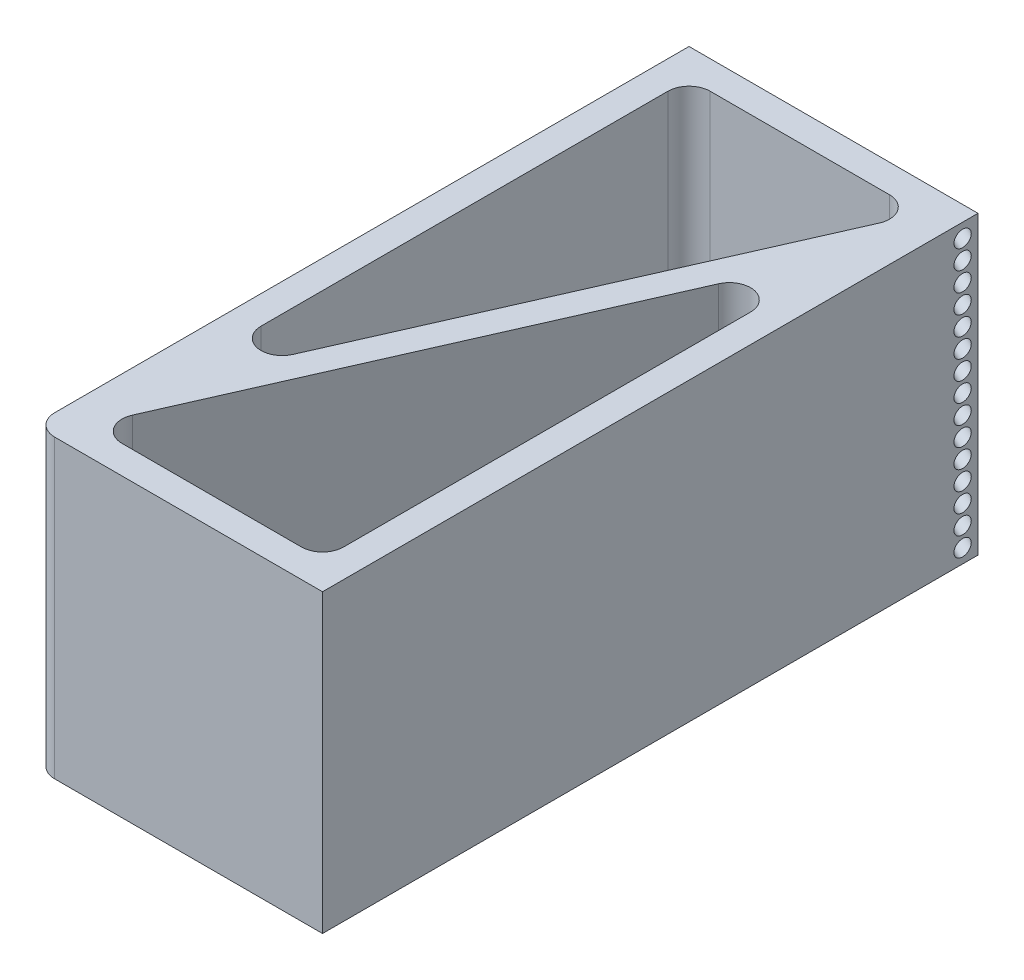
ISO-10303-21;
HEADER;
FILE_DESCRIPTION(('STEP AP214'),'2;1');
FILE_NAME('part.step','',(''),(''),'','','');
FILE_SCHEMA(('AUTOMOTIVE_DESIGN { 1 0 10303 214 1 1 1 1 }'));
ENDSEC;
DATA;
#1=APPLICATION_CONTEXT('core data for automotive mechanical design processes');
#2=APPLICATION_PROTOCOL_DEFINITION('international standard','automotive_design',2000,#1);
#3=PRODUCT_CONTEXT('',#1,'mechanical');
#4=PRODUCT('Part','Part','',(#3));
#5=PRODUCT_RELATED_PRODUCT_CATEGORY('part','',(#4));
#6=PRODUCT_DEFINITION_FORMATION('','',#4);
#7=PRODUCT_DEFINITION_CONTEXT('part definition',#1,'design');
#8=PRODUCT_DEFINITION('design','',#6,#7);
#9=PRODUCT_DEFINITION_SHAPE('','',#8);
#10=(LENGTH_UNIT() NAMED_UNIT(*) SI_UNIT(.MILLI.,.METRE.));
#11=(NAMED_UNIT(*) PLANE_ANGLE_UNIT() SI_UNIT($,.RADIAN.));
#12=(NAMED_UNIT(*) SI_UNIT($,.STERADIAN.) SOLID_ANGLE_UNIT());
#13=UNCERTAINTY_MEASURE_WITH_UNIT(LENGTH_MEASURE(1.E-05),#10,'distance_accuracy_value','');
#14=(GEOMETRIC_REPRESENTATION_CONTEXT(3) GLOBAL_UNCERTAINTY_ASSIGNED_CONTEXT((#13)) GLOBAL_UNIT_ASSIGNED_CONTEXT((#10,
#11,#12)) REPRESENTATION_CONTEXT('',''));
#15=CARTESIAN_POINT('',(0.,0.,0.));
#16=DIRECTION('',(0.,0.,1.));
#17=DIRECTION('',(1.,0.,0.));
#18=AXIS2_PLACEMENT_3D('',#15,#16,#17);
#19=CARTESIAN_POINT('',(20.5,42.,46.5));
#20=DIRECTION('',(-1.,0.,0.));
#21=DIRECTION('',(0.,0.,1.));
#22=AXIS2_PLACEMENT_3D('',#19,#20,#21);
#23=PLANE('',#22);
#24=CARTESIAN_POINT('',(20.5,40.,-44.3142665036951));
#25=DIRECTION('',(-1.,0.,0.));
#26=DIRECTION('',(0.,0.,-1.));
#27=AXIS2_PLACEMENT_3D('',#24,#25,#26);
#28=ELLIPSE('',#27,1.22947509167147,1.125);
#29=CARTESIAN_POINT('',(20.5,40.,-45.5437415953666));
#30=VERTEX_POINT('',#29);
#31=EDGE_CURVE('E242',#30,#30,#28,.T.);
#32=ORIENTED_EDGE('',*,*,#31,.T.);
#33=EDGE_LOOP('',(#32));
#34=FACE_BOUND('',#33,.T.);
#35=CARTESIAN_POINT('',(20.5,37.2857142857143,-44.3142665036951));
#36=DIRECTION('',(-1.,0.,0.));
#37=DIRECTION('',(0.,0.,-1.));
#38=AXIS2_PLACEMENT_3D('',#35,#36,#37);
#39=ELLIPSE('',#38,1.22947509167147,1.125);
#40=CARTESIAN_POINT('',(20.5,37.2857142857143,-45.5437415953666));
#41=VERTEX_POINT('',#40);
#42=EDGE_CURVE('E239',#41,#41,#39,.T.);
#43=ORIENTED_EDGE('',*,*,#42,.T.);
#44=EDGE_LOOP('',(#43));
#45=FACE_BOUND('',#44,.T.);
#46=CARTESIAN_POINT('',(20.5,34.5714285714286,-44.3142665036951));
#47=DIRECTION('',(-1.,0.,0.));
#48=DIRECTION('',(0.,0.,-1.));
#49=AXIS2_PLACEMENT_3D('',#46,#47,#48);
#50=ELLIPSE('',#49,1.22947509167147,1.125);
#51=CARTESIAN_POINT('',(20.5,34.5714285714286,-45.5437415953665));
#52=VERTEX_POINT('',#51);
#53=EDGE_CURVE('E235',#52,#52,#50,.T.);
#54=ORIENTED_EDGE('',*,*,#53,.T.);
#55=EDGE_LOOP('',(#54));
#56=FACE_BOUND('',#55,.T.);
#57=CARTESIAN_POINT('',(20.5,31.8571428571429,-44.3142665036951));
#58=DIRECTION('',(-1.,0.,0.));
#59=DIRECTION('',(0.,0.,-1.));
#60=AXIS2_PLACEMENT_3D('',#57,#58,#59);
#61=ELLIPSE('',#60,1.22947509167147,1.125);
#62=CARTESIAN_POINT('',(20.5,31.8571428571429,-45.5437415953665));
#63=VERTEX_POINT('',#62);
#64=EDGE_CURVE('E231',#63,#63,#61,.T.);
#65=ORIENTED_EDGE('',*,*,#64,.T.);
#66=EDGE_LOOP('',(#65));
#67=FACE_BOUND('',#66,.T.);
#68=CARTESIAN_POINT('',(20.5,29.1428571428571,-44.314266503695));
#69=DIRECTION('',(-1.,0.,0.));
#70=DIRECTION('',(0.,0.,-1.));
#71=AXIS2_PLACEMENT_3D('',#68,#69,#70);
#72=ELLIPSE('',#71,1.22947509167147,1.125);
#73=CARTESIAN_POINT('',(20.5,29.1428571428571,-45.5437415953665));
#74=VERTEX_POINT('',#73);
#75=EDGE_CURVE('E227',#74,#74,#72,.T.);
#76=ORIENTED_EDGE('',*,*,#75,.T.);
#77=EDGE_LOOP('',(#76));
#78=FACE_BOUND('',#77,.T.);
#79=CARTESIAN_POINT('',(20.5,26.4285714285714,-44.314266503695));
#80=DIRECTION('',(-1.,0.,0.));
#81=DIRECTION('',(0.,0.,-1.));
#82=AXIS2_PLACEMENT_3D('',#79,#80,#81);
#83=ELLIPSE('',#82,1.22947509167147,1.125);
#84=CARTESIAN_POINT('',(20.5,26.4285714285714,-45.5437415953665));
#85=VERTEX_POINT('',#84);
#86=EDGE_CURVE('E223',#85,#85,#83,.T.);
#87=ORIENTED_EDGE('',*,*,#86,.T.);
#88=EDGE_LOOP('',(#87));
#89=FACE_BOUND('',#88,.T.);
#90=CARTESIAN_POINT('',(20.5,23.7142857142857,-44.314266503695));
#91=DIRECTION('',(-1.,0.,0.));
#92=DIRECTION('',(0.,0.,-1.));
#93=AXIS2_PLACEMENT_3D('',#90,#91,#92);
#94=ELLIPSE('',#93,1.22947509167148,1.125);
#95=CARTESIAN_POINT('',(20.5,23.7142857142857,-45.5437415953664));
#96=VERTEX_POINT('',#95);
#97=EDGE_CURVE('E219',#96,#96,#94,.T.);
#98=ORIENTED_EDGE('',*,*,#97,.T.);
#99=EDGE_LOOP('',(#98));
#100=FACE_BOUND('',#99,.T.);
#101=CARTESIAN_POINT('',(20.5,21.,-44.3142665036949));
#102=DIRECTION('',(-1.,0.,0.));
#103=DIRECTION('',(0.,0.,-1.));
#104=AXIS2_PLACEMENT_3D('',#101,#102,#103);
#105=ELLIPSE('',#104,1.22947509167147,1.125);
#106=CARTESIAN_POINT('',(20.5,21.,-45.5437415953664));
#107=VERTEX_POINT('',#106);
#108=EDGE_CURVE('E215',#107,#107,#105,.T.);
#109=ORIENTED_EDGE('',*,*,#108,.T.);
#110=EDGE_LOOP('',(#109));
#111=FACE_BOUND('',#110,.T.);
#112=CARTESIAN_POINT('',(20.5,18.2857142857143,-44.3142665036949));
#113=DIRECTION('',(-1.,0.,0.));
#114=DIRECTION('',(0.,0.,-1.));
#115=AXIS2_PLACEMENT_3D('',#112,#113,#114);
#116=ELLIPSE('',#115,1.22947509167147,1.125);
#117=CARTESIAN_POINT('',(20.5,18.2857142857143,-45.5437415953664));
#118=VERTEX_POINT('',#117);
#119=EDGE_CURVE('E211',#118,#118,#116,.T.);
#120=ORIENTED_EDGE('',*,*,#119,.T.);
#121=EDGE_LOOP('',(#120));
#122=FACE_BOUND('',#121,.T.);
#123=CARTESIAN_POINT('',(20.5,15.5714285714286,-44.3142665036949));
#124=DIRECTION('',(-1.,0.,0.));
#125=DIRECTION('',(0.,0.,-1.));
#126=AXIS2_PLACEMENT_3D('',#123,#124,#125);
#127=ELLIPSE('',#126,1.22947509167148,1.125);
#128=CARTESIAN_POINT('',(20.5,15.5714285714286,-45.5437415953663));
#129=VERTEX_POINT('',#128);
#130=EDGE_CURVE('E207',#129,#129,#127,.T.);
#131=ORIENTED_EDGE('',*,*,#130,.T.);
#132=EDGE_LOOP('',(#131));
#133=FACE_BOUND('',#132,.T.);
#134=CARTESIAN_POINT('',(20.5,12.8571428571429,-44.3142665036948));
#135=DIRECTION('',(-1.,0.,0.));
#136=DIRECTION('',(0.,0.,-1.));
#137=AXIS2_PLACEMENT_3D('',#134,#135,#136);
#138=ELLIPSE('',#137,1.22947509167147,1.125);
#139=CARTESIAN_POINT('',(20.5,12.8571428571429,-45.5437415953663));
#140=VERTEX_POINT('',#139);
#141=EDGE_CURVE('E203',#140,#140,#138,.T.);
#142=ORIENTED_EDGE('',*,*,#141,.T.);
#143=EDGE_LOOP('',(#142));
#144=FACE_BOUND('',#143,.T.);
#145=CARTESIAN_POINT('',(20.5,10.1428571428571,-44.3142665036948));
#146=DIRECTION('',(-1.,0.,0.));
#147=DIRECTION('',(0.,0.,-1.));
#148=AXIS2_PLACEMENT_3D('',#145,#146,#147);
#149=ELLIPSE('',#148,1.22947509167147,1.125);
#150=CARTESIAN_POINT('',(20.5,10.1428571428571,-45.5437415953663));
#151=VERTEX_POINT('',#150);
#152=EDGE_CURVE('E199',#151,#151,#149,.T.);
#153=ORIENTED_EDGE('',*,*,#152,.T.);
#154=EDGE_LOOP('',(#153));
#155=FACE_BOUND('',#154,.T.);
#156=CARTESIAN_POINT('',(20.5,7.42857142857143,-44.3142665036948));
#157=DIRECTION('',(-1.,0.,0.));
#158=DIRECTION('',(0.,0.,-1.));
#159=AXIS2_PLACEMENT_3D('',#156,#157,#158);
#160=ELLIPSE('',#159,1.22947509167148,1.125);
#161=CARTESIAN_POINT('',(20.5,7.42857142857143,-45.5437415953662));
#162=VERTEX_POINT('',#161);
#163=EDGE_CURVE('E195',#162,#162,#160,.T.);
#164=ORIENTED_EDGE('',*,*,#163,.T.);
#165=EDGE_LOOP('',(#164));
#166=FACE_BOUND('',#165,.T.);
#167=CARTESIAN_POINT('',(20.5,4.71428571428572,-44.3142665036947));
#168=DIRECTION('',(-1.,0.,0.));
#169=DIRECTION('',(0.,0.,-1.));
#170=AXIS2_PLACEMENT_3D('',#167,#168,#169);
#171=ELLIPSE('',#170,1.22947509167147,1.125);
#172=CARTESIAN_POINT('',(20.5,4.71428571428572,-45.5437415953662));
#173=VERTEX_POINT('',#172);
#174=EDGE_CURVE('E191',#173,#173,#171,.T.);
#175=ORIENTED_EDGE('',*,*,#174,.T.);
#176=EDGE_LOOP('',(#175));
#177=FACE_BOUND('',#176,.T.);
#178=CARTESIAN_POINT('',(20.5,2.,-44.3142665036947));
#179=DIRECTION('',(-1.,0.,0.));
#180=DIRECTION('',(0.,0.,-1.));
#181=AXIS2_PLACEMENT_3D('',#178,#179,#180);
#182=ELLIPSE('',#181,1.22947509167148,1.125);
#183=CARTESIAN_POINT('',(20.5,2.,-45.5437415953662));
#184=VERTEX_POINT('',#183);
#185=EDGE_CURVE('E186',#184,#184,#182,.T.);
#186=ORIENTED_EDGE('',*,*,#185,.T.);
#187=EDGE_LOOP('',(#186));
#188=FACE_BOUND('',#187,.T.);
#189=DIRECTION('',(0.,0.,-1.));
#190=VECTOR('',#189,1.);
#191=CARTESIAN_POINT('',(20.5,0.,46.5));
#192=LINE('',#191,#190);
#193=CARTESIAN_POINT('',(20.5,0.,46.5));
#194=VERTEX_POINT('',#193);
#195=CARTESIAN_POINT('',(20.5,0.,-46.5));
#196=VERTEX_POINT('',#195);
#197=EDGE_CURVE('E174',#194,#196,#192,.T.);
#198=ORIENTED_EDGE('',*,*,#197,.T.);
#199=DIRECTION('',(0.,-1.,0.));
#200=VECTOR('',#199,1.);
#201=CARTESIAN_POINT('',(20.5,42.,-46.5));
#202=LINE('',#201,#200);
#203=CARTESIAN_POINT('',(20.5,42.,-46.5));
#204=VERTEX_POINT('',#203);
#205=EDGE_CURVE('E156',#204,#196,#202,.T.);
#206=ORIENTED_EDGE('',*,*,#205,.F.);
#207=DIRECTION('',(0.,0.,-1.));
#208=VECTOR('',#207,1.);
#209=CARTESIAN_POINT('',(20.5,42.,46.5));
#210=LINE('',#209,#208);
#211=CARTESIAN_POINT('',(20.5,42.,46.5));
#212=VERTEX_POINT('',#211);
#213=EDGE_CURVE('E162',#212,#204,#210,.T.);
#214=ORIENTED_EDGE('',*,*,#213,.F.);
#215=DIRECTION('',(0.,-1.,0.));
#216=VECTOR('',#215,1.);
#217=CARTESIAN_POINT('',(20.5,42.,46.5));
#218=LINE('',#217,#216);
#219=EDGE_CURVE('E179',#212,#194,#218,.T.);
#220=ORIENTED_EDGE('',*,*,#219,.T.);
#221=EDGE_LOOP('',(#198,#206,#214,#220));
#222=FACE_BOUND('',#221,.T.);
#223=ADVANCED_FACE('F33',(#34,#45,#56,#67,#78,#89,#100,#111,#122,#133,#144,#155,#166,#177,#188,
#222),#23,.F.);
#224=CARTESIAN_POINT('',(-20.5,42.,-46.5));
#225=DIRECTION('',(0.,0.,1.));
#226=DIRECTION('',(1.,0.,0.));
#227=AXIS2_PLACEMENT_3D('',#224,#225,#226);
#228=PLANE('',#227);
#229=CARTESIAN_POINT('',(15.5421167035036,40.,-46.5));
#230=DIRECTION('',(0.,0.,1.));
#231=DIRECTION('',(-1.,0.,0.));
#232=AXIS2_PLACEMENT_3D('',#229,#230,#231);
#233=ELLIPSE('',#232,2.78880935427919,1.125);
#234=CARTESIAN_POINT('',(12.7533073492244,40.,-46.5));
#235=VERTEX_POINT('',#234);
#236=EDGE_CURVE('E240',#235,#235,#233,.T.);
#237=ORIENTED_EDGE('',*,*,#236,.T.);
#238=EDGE_LOOP('',(#237));
#239=FACE_BOUND('',#238,.T.);
#240=CARTESIAN_POINT('',(15.5421167035036,37.2857142857143,-46.5));
#241=DIRECTION('',(0.,0.,1.));
#242=DIRECTION('',(-1.,0.,0.));
#243=AXIS2_PLACEMENT_3D('',#240,#241,#242);
#244=ELLIPSE('',#243,2.78880935427919,1.125);
#245=CARTESIAN_POINT('',(12.7533073492244,37.2857142857143,-46.5));
#246=VERTEX_POINT('',#245);
#247=EDGE_CURVE('E236',#246,#246,#244,.T.);
#248=ORIENTED_EDGE('',*,*,#247,.T.);
#249=EDGE_LOOP('',(#248));
#250=FACE_BOUND('',#249,.T.);
#251=CARTESIAN_POINT('',(15.5421167035035,34.5714285714286,-46.5));
#252=DIRECTION('',(0.,0.,1.));
#253=DIRECTION('',(-1.,0.,0.));
#254=AXIS2_PLACEMENT_3D('',#251,#252,#253);
#255=ELLIPSE('',#254,2.78880935427919,1.125);
#256=CARTESIAN_POINT('',(12.7533073492243,34.5714285714286,-46.5));
#257=VERTEX_POINT('',#256);
#258=EDGE_CURVE('E232',#257,#257,#255,.T.);
#259=ORIENTED_EDGE('',*,*,#258,.T.);
#260=EDGE_LOOP('',(#259));
#261=FACE_BOUND('',#260,.T.);
#262=CARTESIAN_POINT('',(15.5421167035034,31.8571428571429,-46.5));
#263=DIRECTION('',(0.,0.,1.));
#264=DIRECTION('',(-1.,0.,0.));
#265=AXIS2_PLACEMENT_3D('',#262,#263,#264);
#266=ELLIPSE('',#265,2.78880935427919,1.125);
#267=CARTESIAN_POINT('',(12.7533073492242,31.8571428571429,-46.5));
#268=VERTEX_POINT('',#267);
#269=EDGE_CURVE('E228',#268,#268,#266,.T.);
#270=ORIENTED_EDGE('',*,*,#269,.T.);
#271=EDGE_LOOP('',(#270));
#272=FACE_BOUND('',#271,.T.);
#273=CARTESIAN_POINT('',(15.5421167035033,29.1428571428571,-46.5));
#274=DIRECTION('',(0.,0.,1.));
#275=DIRECTION('',(-1.,0.,0.));
#276=AXIS2_PLACEMENT_3D('',#273,#274,#275);
#277=ELLIPSE('',#276,2.78880935427919,1.125);
#278=CARTESIAN_POINT('',(12.7533073492241,29.1428571428571,-46.5));
#279=VERTEX_POINT('',#278);
#280=EDGE_CURVE('E224',#279,#279,#277,.T.);
#281=ORIENTED_EDGE('',*,*,#280,.T.);
#282=EDGE_LOOP('',(#281));
#283=FACE_BOUND('',#282,.T.);
#284=CARTESIAN_POINT('',(15.5421167035033,26.4285714285714,-46.5));
#285=DIRECTION('',(0.,0.,1.));
#286=DIRECTION('',(-1.,0.,0.));
#287=AXIS2_PLACEMENT_3D('',#284,#285,#286);
#288=ELLIPSE('',#287,2.78880935427919,1.125);
#289=CARTESIAN_POINT('',(12.7533073492241,26.4285714285714,-46.5));
#290=VERTEX_POINT('',#289);
#291=EDGE_CURVE('E220',#290,#290,#288,.T.);
#292=ORIENTED_EDGE('',*,*,#291,.T.);
#293=EDGE_LOOP('',(#292));
#294=FACE_BOUND('',#293,.T.);
#295=CARTESIAN_POINT('',(15.5421167035032,23.7142857142857,-46.5));
#296=DIRECTION('',(0.,0.,1.));
#297=DIRECTION('',(-1.,0.,0.));
#298=AXIS2_PLACEMENT_3D('',#295,#296,#297);
#299=ELLIPSE('',#298,2.78880935427921,1.125);
#300=CARTESIAN_POINT('',(12.753307349224,23.7142857142857,-46.5));
#301=VERTEX_POINT('',#300);
#302=EDGE_CURVE('E216',#301,#301,#299,.T.);
#303=ORIENTED_EDGE('',*,*,#302,.T.);
#304=EDGE_LOOP('',(#303));
#305=FACE_BOUND('',#304,.T.);
#306=CARTESIAN_POINT('',(15.5421167035031,21.,-46.5));
#307=DIRECTION('',(0.,0.,1.));
#308=DIRECTION('',(-1.,0.,0.));
#309=AXIS2_PLACEMENT_3D('',#306,#307,#308);
#310=ELLIPSE('',#309,2.78880935427919,1.125);
#311=CARTESIAN_POINT('',(12.7533073492239,21.,-46.5));
#312=VERTEX_POINT('',#311);
#313=EDGE_CURVE('E212',#312,#312,#310,.T.);
#314=ORIENTED_EDGE('',*,*,#313,.T.);
#315=EDGE_LOOP('',(#314));
#316=FACE_BOUND('',#315,.T.);
#317=CARTESIAN_POINT('',(15.542116703503,18.2857142857143,-46.5));
#318=DIRECTION('',(0.,0.,1.));
#319=DIRECTION('',(-1.,0.,0.));
#320=AXIS2_PLACEMENT_3D('',#317,#318,#319);
#321=ELLIPSE('',#320,2.78880935427919,1.125);
#322=CARTESIAN_POINT('',(12.7533073492239,18.2857142857143,-46.5));
#323=VERTEX_POINT('',#322);
#324=EDGE_CURVE('E208',#323,#323,#321,.T.);
#325=ORIENTED_EDGE('',*,*,#324,.T.);
#326=EDGE_LOOP('',(#325));
#327=FACE_BOUND('',#326,.T.);
#328=CARTESIAN_POINT('',(15.542116703503,15.5714285714286,-46.5));
#329=DIRECTION('',(0.,0.,1.));
#330=DIRECTION('',(-1.,0.,0.));
#331=AXIS2_PLACEMENT_3D('',#328,#329,#330);
#332=ELLIPSE('',#331,2.7888093542792,1.125);
#333=CARTESIAN_POINT('',(12.7533073492238,15.5714285714286,-46.5));
#334=VERTEX_POINT('',#333);
#335=EDGE_CURVE('E204',#334,#334,#332,.T.);
#336=ORIENTED_EDGE('',*,*,#335,.T.);
#337=EDGE_LOOP('',(#336));
#338=FACE_BOUND('',#337,.T.);
#339=CARTESIAN_POINT('',(15.5421167035029,12.8571428571429,-46.5));
#340=DIRECTION('',(0.,0.,1.));
#341=DIRECTION('',(-1.,0.,0.));
#342=AXIS2_PLACEMENT_3D('',#339,#340,#341);
#343=ELLIPSE('',#342,2.78880935427919,1.125);
#344=CARTESIAN_POINT('',(12.7533073492237,12.8571428571429,-46.5));
#345=VERTEX_POINT('',#344);
#346=EDGE_CURVE('E200',#345,#345,#343,.T.);
#347=ORIENTED_EDGE('',*,*,#346,.T.);
#348=EDGE_LOOP('',(#347));
#349=FACE_BOUND('',#348,.T.);
#350=CARTESIAN_POINT('',(15.5421167035028,10.1428571428571,-46.5));
#351=DIRECTION('',(0.,0.,1.));
#352=DIRECTION('',(-1.,0.,0.));
#353=AXIS2_PLACEMENT_3D('',#350,#351,#352);
#354=ELLIPSE('',#353,2.78880935427919,1.125);
#355=CARTESIAN_POINT('',(12.7533073492237,10.1428571428571,-46.5));
#356=VERTEX_POINT('',#355);
#357=EDGE_CURVE('E196',#356,#356,#354,.T.);
#358=ORIENTED_EDGE('',*,*,#357,.T.);
#359=EDGE_LOOP('',(#358));
#360=FACE_BOUND('',#359,.T.);
#361=CARTESIAN_POINT('',(15.5421167035028,7.42857142857143,-46.5));
#362=DIRECTION('',(0.,0.,1.));
#363=DIRECTION('',(-1.,0.,0.));
#364=AXIS2_PLACEMENT_3D('',#361,#362,#363);
#365=ELLIPSE('',#364,2.78880935427921,1.125);
#366=CARTESIAN_POINT('',(12.7533073492236,7.42857142857143,-46.5));
#367=VERTEX_POINT('',#366);
#368=EDGE_CURVE('E192',#367,#367,#365,.T.);
#369=ORIENTED_EDGE('',*,*,#368,.T.);
#370=EDGE_LOOP('',(#369));
#371=FACE_BOUND('',#370,.T.);
#372=CARTESIAN_POINT('',(15.5421167035027,4.71428571428572,-46.5));
#373=DIRECTION('',(0.,0.,1.));
#374=DIRECTION('',(-1.,0.,0.));
#375=AXIS2_PLACEMENT_3D('',#372,#373,#374);
#376=ELLIPSE('',#375,2.78880935427919,1.125);
#377=CARTESIAN_POINT('',(12.7533073492235,4.71428571428572,-46.5));
#378=VERTEX_POINT('',#377);
#379=EDGE_CURVE('E188',#378,#378,#376,.T.);
#380=ORIENTED_EDGE('',*,*,#379,.T.);
#381=EDGE_LOOP('',(#380));
#382=FACE_BOUND('',#381,.T.);
#383=CARTESIAN_POINT('',(15.5421167035026,2.,-46.5));
#384=DIRECTION('',(0.,0.,1.));
#385=DIRECTION('',(-1.,0.,0.));
#386=AXIS2_PLACEMENT_3D('',#383,#384,#385);
#387=ELLIPSE('',#386,2.78880935427921,1.125);
#388=CARTESIAN_POINT('',(12.7533073492234,2.,-46.5));
#389=VERTEX_POINT('',#388);
#390=EDGE_CURVE('E183',#389,#389,#387,.T.);
#391=ORIENTED_EDGE('',*,*,#390,.T.);
#392=EDGE_LOOP('',(#391));
#393=FACE_BOUND('',#392,.T.);
#394=DIRECTION('',(-1.,0.,0.));
#395=VECTOR('',#394,1.);
#396=CARTESIAN_POINT('',(-20.5,0.,-46.5));
#397=LINE('',#396,#395);
#398=CARTESIAN_POINT('',(-20.5,0.,-46.5));
#399=VERTEX_POINT('',#398);
#400=EDGE_CURVE('E306',#196,#399,#397,.T.);
#401=ORIENTED_EDGE('',*,*,#400,.T.);
#402=DIRECTION('',(0.,-1.,0.));
#403=VECTOR('',#402,1.);
#404=CARTESIAN_POINT('',(-20.5,42.,-46.5));
#405=LINE('',#404,#403);
#406=CARTESIAN_POINT('',(-20.5,42.,-46.5));
#407=VERTEX_POINT('',#406);
#408=EDGE_CURVE('E159',#407,#399,#405,.T.);
#409=ORIENTED_EDGE('',*,*,#408,.F.);
#410=DIRECTION('',(-1.,0.,0.));
#411=VECTOR('',#410,1.);
#412=CARTESIAN_POINT('',(-20.5,42.,-46.5));
#413=LINE('',#412,#411);
#414=EDGE_CURVE('E152',#204,#407,#413,.T.);
#415=ORIENTED_EDGE('',*,*,#414,.F.);
#416=ORIENTED_EDGE('',*,*,#205,.T.);
#417=EDGE_LOOP('',(#401,#409,#415,#416));
#418=FACE_BOUND('',#417,.T.);
#419=ADVANCED_FACE('F154',(#239,#250,#261,#272,#283,#294,#305,#316,#327,#338,#349,#360,#371,
#382,#393,#418),#228,.F.);
#420=CARTESIAN_POINT('',(-20.5,42.,46.5));
#421=DIRECTION('',(1.,0.,0.));
#422=DIRECTION('',(0.,0.,-1.));
#423=AXIS2_PLACEMENT_3D('',#420,#421,#422);
#424=PLANE('',#423);
#425=DIRECTION('',(0.,0.,1.));
#426=VECTOR('',#425,1.);
#427=CARTESIAN_POINT('',(-20.5,0.,46.5));
#428=LINE('',#427,#426);
#429=CARTESIAN_POINT('',(-20.5,0.,43.5));
#430=VERTEX_POINT('',#429);
#431=EDGE_CURVE('E304',#399,#430,#428,.T.);
#432=ORIENTED_EDGE('',*,*,#431,.T.);
#433=DIRECTION('',(0.,-1.,0.));
#434=VECTOR('',#433,1.);
#435=CARTESIAN_POINT('',(-20.5,42.,43.5));
#436=LINE('',#435,#434);
#437=CARTESIAN_POINT('',(-20.5,42.,43.5));
#438=VERTEX_POINT('',#437);
#439=EDGE_CURVE('E41',#430,#438,#436,.F.);
#440=ORIENTED_EDGE('',*,*,#439,.T.);
#441=DIRECTION('',(0.,0.,1.));
#442=VECTOR('',#441,1.);
#443=CARTESIAN_POINT('',(-20.5,42.,46.5));
#444=LINE('',#443,#442);
#445=EDGE_CURVE('E161',#407,#438,#444,.T.);
#446=ORIENTED_EDGE('',*,*,#445,.F.);
#447=ORIENTED_EDGE('',*,*,#408,.T.);
#448=EDGE_LOOP('',(#432,#440,#446,#447));
#449=FACE_BOUND('',#448,.T.);
#450=ADVANCED_FACE('F312',(#449),#424,.F.);
#451=CARTESIAN_POINT('',(-20.5,42.,46.5));
#452=DIRECTION('',(0.,0.,-1.));
#453=DIRECTION('',(-1.,0.,0.));
#454=AXIS2_PLACEMENT_3D('',#451,#452,#453);
#455=PLANE('',#454);
#456=DIRECTION('',(1.,0.,0.));
#457=VECTOR('',#456,1.);
#458=CARTESIAN_POINT('',(-20.5,42.,46.5));
#459=LINE('',#458,#457);
#460=CARTESIAN_POINT('',(-17.5,42.,46.5));
#461=VERTEX_POINT('',#460);
#462=EDGE_CURVE('E167',#461,#212,#459,.T.);
#463=ORIENTED_EDGE('',*,*,#462,.F.);
#464=DIRECTION('',(0.,-1.,0.));
#465=VECTOR('',#464,1.);
#466=CARTESIAN_POINT('',(-17.5,42.,46.5));
#467=LINE('',#466,#465);
#468=CARTESIAN_POINT('',(-17.5,0.,46.5));
#469=VERTEX_POINT('',#468);
#470=EDGE_CURVE('E295',#461,#469,#467,.T.);
#471=ORIENTED_EDGE('',*,*,#470,.T.);
#472=DIRECTION('',(1.,0.,0.));
#473=VECTOR('',#472,1.);
#474=CARTESIAN_POINT('',(-20.5,0.,46.5));
#475=LINE('',#474,#473);
#476=EDGE_CURVE('E171',#469,#194,#475,.T.);
#477=ORIENTED_EDGE('',*,*,#476,.T.);
#478=ORIENTED_EDGE('',*,*,#219,.F.);
#479=EDGE_LOOP('',(#463,#471,#477,#478));
#480=FACE_BOUND('',#479,.T.);
#481=ADVANCED_FACE('F300',(#480),#455,.F.);
#482=CARTESIAN_POINT('',(0.,42.,0.));
#483=DIRECTION('',(0.,-1.,0.));
#484=DIRECTION('',(0.,0.,-1.));
#485=AXIS2_PLACEMENT_3D('',#482,#483,#484);
#486=PLANE('',#485);
#487=DIRECTION('',(1.,0.,0.));
#488=VECTOR('',#487,1.);
#489=CARTESIAN_POINT('',(16.5508256434801,42.,-42.5));
#490=LINE('',#489,#488);
#491=CARTESIAN_POINT('',(-13.5,42.,-42.5));
#492=VERTEX_POINT('',#491);
#493=CARTESIAN_POINT('',(11.9496447538615,42.,-42.5));
#494=VERTEX_POINT('',#493);
#495=EDGE_CURVE('E665',#492,#494,#490,.T.);
#496=ORIENTED_EDGE('',*,*,#495,.T.);
#497=CARTESIAN_POINT('',(11.9496447538615,42.,-39.5));
#498=DIRECTION('',(0.,-1.,0.));
#499=DIRECTION('',(0.,0.,-1.));
#500=AXIS2_PLACEMENT_3D('',#497,#498,#499);
#501=CIRCLE('',#500,3.);
#502=CARTESIAN_POINT('',(14.6947186661859,42.,-38.2898061246742));
#503=VERTEX_POINT('',#502);
#504=EDGE_CURVE('E293',#494,#503,#501,.T.);
#505=ORIENTED_EDGE('',*,*,#504,.T.);
#506=DIRECTION('',(-0.403397958441935,0.,0.915024637441462));
#507=VECTOR('',#506,1.);
#508=CARTESIAN_POINT('',(-16.5,42.,32.4689459717963));
#509=LINE('',#508,#507);
#510=CARTESIAN_POINT('',(-10.7549260876756,42.,19.4374368535971));
#511=VERTEX_POINT('',#510);
#512=EDGE_CURVE('E383',#503,#511,#509,.T.);
#513=ORIENTED_EDGE('',*,*,#512,.T.);
#514=CARTESIAN_POINT('',(-13.5,42.,18.2272429782713));
#515=DIRECTION('',(0.,-1.,0.));
#516=DIRECTION('',(0.,0.,-1.));
#517=AXIS2_PLACEMENT_3D('',#514,#515,#516);
#518=CIRCLE('',#517,3.);
#519=CARTESIAN_POINT('',(-16.5,42.,18.2272429782713));
#520=VERTEX_POINT('',#519);
#521=EDGE_CURVE('E277',#511,#520,#518,.T.);
#522=ORIENTED_EDGE('',*,*,#521,.T.);
#523=DIRECTION('',(0.,0.,-1.));
#524=VECTOR('',#523,1.);
#525=CARTESIAN_POINT('',(-16.5,42.,-42.5));
#526=LINE('',#525,#524);
#527=CARTESIAN_POINT('',(-16.5,42.,-39.5));
#528=VERTEX_POINT('',#527);
#529=EDGE_CURVE('E671',#520,#528,#526,.T.);
#530=ORIENTED_EDGE('',*,*,#529,.T.);
#531=CARTESIAN_POINT('',(-13.5,42.,-39.5));
#532=DIRECTION('',(0.,-1.,0.));
#533=DIRECTION('',(0.,0.,-1.));
#534=AXIS2_PLACEMENT_3D('',#531,#532,#533);
#535=CIRCLE('',#534,3.);
#536=EDGE_CURVE('E273',#528,#492,#535,.T.);
#537=ORIENTED_EDGE('',*,*,#536,.T.);
#538=EDGE_LOOP('',(#496,#505,#513,#522,#530,#537));
#539=FACE_BOUND('',#538,.T.);
#540=DIRECTION('',(-1.,0.,0.));
#541=VECTOR('',#540,1.);
#542=CARTESIAN_POINT('',(16.5,42.,42.5));
#543=LINE('',#542,#541);
#544=CARTESIAN_POINT('',(13.5,42.,42.5));
#545=VERTEX_POINT('',#544);
#546=CARTESIAN_POINT('',(-11.9496447538616,42.,42.5));
#547=VERTEX_POINT('',#546);
#548=EDGE_CURVE('E369',#545,#547,#543,.T.);
#549=ORIENTED_EDGE('',*,*,#548,.T.);
#550=CARTESIAN_POINT('',(-11.9496447538616,42.,39.5));
#551=DIRECTION('',(0.,-1.,0.));
#552=DIRECTION('',(0.,0.,-1.));
#553=AXIS2_PLACEMENT_3D('',#550,#551,#552);
#554=CIRCLE('',#553,3.);
#555=CARTESIAN_POINT('',(-14.6947186661859,42.,38.2898061246742));
#556=VERTEX_POINT('',#555);
#557=EDGE_CURVE('E281',#547,#556,#554,.T.);
#558=ORIENTED_EDGE('',*,*,#557,.T.);
#559=DIRECTION('',(0.403397958441935,0.,-0.915024637441462));
#560=VECTOR('',#559,1.);
#561=CARTESIAN_POINT('',(-16.5508256434801,42.,42.5));
#562=LINE('',#561,#560);
#563=CARTESIAN_POINT('',(10.7549260876756,42.,-19.4374368535971));
#564=VERTEX_POINT('',#563);
#565=EDGE_CURVE('E187',#556,#564,#562,.T.);
#566=ORIENTED_EDGE('',*,*,#565,.T.);
#567=CARTESIAN_POINT('',(13.5,42.,-18.2272429782713));
#568=DIRECTION('',(0.,-1.,0.));
#569=DIRECTION('',(0.,0.,-1.));
#570=AXIS2_PLACEMENT_3D('',#567,#568,#569);
#571=CIRCLE('',#570,3.);
#572=CARTESIAN_POINT('',(16.5,42.,-18.2272429782713));
#573=VERTEX_POINT('',#572);
#574=EDGE_CURVE('E289',#564,#573,#571,.T.);
#575=ORIENTED_EDGE('',*,*,#574,.T.);
#576=DIRECTION('',(0.,0.,1.));
#577=VECTOR('',#576,1.);
#578=CARTESIAN_POINT('',(16.5,42.,-32.4689459717963));
#579=LINE('',#578,#577);
#580=CARTESIAN_POINT('',(16.5,42.,39.5));
#581=VERTEX_POINT('',#580);
#582=EDGE_CURVE('E361',#573,#581,#579,.T.);
#583=ORIENTED_EDGE('',*,*,#582,.T.);
#584=CARTESIAN_POINT('',(13.5,42.,39.5));
#585=DIRECTION('',(0.,-1.,0.));
#586=DIRECTION('',(0.,0.,-1.));
#587=AXIS2_PLACEMENT_3D('',#584,#585,#586);
#588=CIRCLE('',#587,3.);
#589=EDGE_CURVE('E285',#581,#545,#588,.T.);
#590=ORIENTED_EDGE('',*,*,#589,.T.);
#591=EDGE_LOOP('',(#549,#558,#566,#575,#583,#590));
#592=FACE_BOUND('',#591,.T.);
#593=ORIENTED_EDGE('',*,*,#445,.T.);
#594=CARTESIAN_POINT('',(-17.5,42.,43.5));
#595=DIRECTION('',(0.,-1.,0.));
#596=DIRECTION('',(0.,0.,-1.));
#597=AXIS2_PLACEMENT_3D('',#594,#595,#596);
#598=CIRCLE('',#597,3.);
#599=EDGE_CURVE('E11',#438,#461,#598,.F.);
#600=ORIENTED_EDGE('',*,*,#599,.T.);
#601=ORIENTED_EDGE('',*,*,#462,.T.);
#602=ORIENTED_EDGE('',*,*,#213,.T.);
#603=ORIENTED_EDGE('',*,*,#414,.T.);
#604=EDGE_LOOP('',(#593,#600,#601,#602,#603));
#605=FACE_BOUND('',#604,.T.);
#606=ADVANCED_FACE('F165',(#539,#592,#605),#486,.F.);
#607=CARTESIAN_POINT('',(0.,0.,0.));
#608=DIRECTION('',(0.,-1.,0.));
#609=DIRECTION('',(0.,0.,-1.));
#610=AXIS2_PLACEMENT_3D('',#607,#608,#609);
#611=PLANE('',#610);
#612=DIRECTION('',(0.,0.,-1.));
#613=VECTOR('',#612,1.);
#614=CARTESIAN_POINT('',(-16.5,0.,-42.5));
#615=LINE('',#614,#613);
#616=CARTESIAN_POINT('',(-16.5,0.,18.2272429782713));
#617=VERTEX_POINT('',#616);
#618=CARTESIAN_POINT('',(-16.5,0.,-39.5));
#619=VERTEX_POINT('',#618);
#620=EDGE_CURVE('E678',#617,#619,#615,.T.);
#621=ORIENTED_EDGE('',*,*,#620,.F.);
#622=CARTESIAN_POINT('',(-13.5,0.,18.2272429782713));
#623=DIRECTION('',(0.,-1.,0.));
#624=DIRECTION('',(0.,0.,-1.));
#625=AXIS2_PLACEMENT_3D('',#622,#623,#624);
#626=CIRCLE('',#625,3.);
#627=CARTESIAN_POINT('',(-10.7549260876756,0.,19.4374368535971));
#628=VERTEX_POINT('',#627);
#629=EDGE_CURVE('E275',#617,#628,#626,.F.);
#630=ORIENTED_EDGE('',*,*,#629,.T.);
#631=DIRECTION('',(-0.403397958441935,0.,0.915024637441462));
#632=VECTOR('',#631,1.);
#633=CARTESIAN_POINT('',(-16.5,0.,32.4689459717963));
#634=LINE('',#633,#632);
#635=CARTESIAN_POINT('',(14.6947186661859,0.,-38.2898061246742));
#636=VERTEX_POINT('',#635);
#637=EDGE_CURVE('E377',#636,#628,#634,.T.);
#638=ORIENTED_EDGE('',*,*,#637,.F.);
#639=CARTESIAN_POINT('',(11.9496447538615,0.,-39.5));
#640=DIRECTION('',(0.,-1.,0.));
#641=DIRECTION('',(0.,0.,-1.));
#642=AXIS2_PLACEMENT_3D('',#639,#640,#641);
#643=CIRCLE('',#642,3.);
#644=CARTESIAN_POINT('',(11.9496447538615,0.,-42.5));
#645=VERTEX_POINT('',#644);
#646=EDGE_CURVE('E291',#636,#645,#643,.F.);
#647=ORIENTED_EDGE('',*,*,#646,.T.);
#648=DIRECTION('',(1.,0.,0.));
#649=VECTOR('',#648,1.);
#650=CARTESIAN_POINT('',(16.5508256434801,0.,-42.5));
#651=LINE('',#650,#649);
#652=CARTESIAN_POINT('',(-13.5,0.,-42.5));
#653=VERTEX_POINT('',#652);
#654=EDGE_CURVE('E679',#653,#645,#651,.T.);
#655=ORIENTED_EDGE('',*,*,#654,.F.);
#656=CARTESIAN_POINT('',(-13.5,0.,-39.5));
#657=DIRECTION('',(0.,-1.,0.));
#658=DIRECTION('',(0.,0.,-1.));
#659=AXIS2_PLACEMENT_3D('',#656,#657,#658);
#660=CIRCLE('',#659,3.);
#661=EDGE_CURVE('E271',#653,#619,#660,.F.);
#662=ORIENTED_EDGE('',*,*,#661,.T.);
#663=EDGE_LOOP('',(#621,#630,#638,#647,#655,#662));
#664=FACE_BOUND('',#663,.T.);
#665=DIRECTION('',(0.,0.,1.));
#666=VECTOR('',#665,1.);
#667=CARTESIAN_POINT('',(16.5,0.,-32.4689459717963));
#668=LINE('',#667,#666);
#669=CARTESIAN_POINT('',(16.5,0.,-18.2272429782713));
#670=VERTEX_POINT('',#669);
#671=CARTESIAN_POINT('',(16.5,0.,39.5));
#672=VERTEX_POINT('',#671);
#673=EDGE_CURVE('E381',#670,#672,#668,.T.);
#674=ORIENTED_EDGE('',*,*,#673,.F.);
#675=CARTESIAN_POINT('',(13.5,0.,-18.2272429782713));
#676=DIRECTION('',(0.,-1.,0.));
#677=DIRECTION('',(0.,0.,-1.));
#678=AXIS2_PLACEMENT_3D('',#675,#676,#677);
#679=CIRCLE('',#678,3.);
#680=CARTESIAN_POINT('',(10.7549260876756,0.,-19.4374368535971));
#681=VERTEX_POINT('',#680);
#682=EDGE_CURVE('E287',#670,#681,#679,.F.);
#683=ORIENTED_EDGE('',*,*,#682,.T.);
#684=DIRECTION('',(0.403397958441935,0.,-0.915024637441462));
#685=VECTOR('',#684,1.);
#686=CARTESIAN_POINT('',(-16.5508256434801,0.,42.5));
#687=LINE('',#686,#685);
#688=CARTESIAN_POINT('',(-14.6947186661859,0.,38.2898061246742));
#689=VERTEX_POINT('',#688);
#690=EDGE_CURVE('E370',#689,#681,#687,.T.);
#691=ORIENTED_EDGE('',*,*,#690,.F.);
#692=CARTESIAN_POINT('',(-11.9496447538616,0.,39.5));
#693=DIRECTION('',(0.,-1.,0.));
#694=DIRECTION('',(0.,0.,-1.));
#695=AXIS2_PLACEMENT_3D('',#692,#693,#694);
#696=CIRCLE('',#695,3.);
#697=CARTESIAN_POINT('',(-11.9496447538616,0.,42.5));
#698=VERTEX_POINT('',#697);
#699=EDGE_CURVE('E279',#689,#698,#696,.F.);
#700=ORIENTED_EDGE('',*,*,#699,.T.);
#701=DIRECTION('',(-1.,0.,0.));
#702=VECTOR('',#701,1.);
#703=CARTESIAN_POINT('',(16.5,0.,42.5));
#704=LINE('',#703,#702);
#705=CARTESIAN_POINT('',(13.5,0.,42.5));
#706=VERTEX_POINT('',#705);
#707=EDGE_CURVE('E374',#706,#698,#704,.T.);
#708=ORIENTED_EDGE('',*,*,#707,.F.);
#709=CARTESIAN_POINT('',(13.5,0.,39.5));
#710=DIRECTION('',(0.,-1.,0.));
#711=DIRECTION('',(0.,0.,-1.));
#712=AXIS2_PLACEMENT_3D('',#709,#710,#711);
#713=CIRCLE('',#712,3.);
#714=EDGE_CURVE('E283',#706,#672,#713,.F.);
#715=ORIENTED_EDGE('',*,*,#714,.T.);
#716=EDGE_LOOP('',(#674,#683,#691,#700,#708,#715));
#717=FACE_BOUND('',#716,.T.);
#718=ORIENTED_EDGE('',*,*,#476,.F.);
#719=CARTESIAN_POINT('',(-17.5,0.,43.5));
#720=DIRECTION('',(0.,-1.,0.));
#721=DIRECTION('',(0.,0.,-1.));
#722=AXIS2_PLACEMENT_3D('',#719,#720,#721);
#723=CIRCLE('',#722,3.);
#724=EDGE_CURVE('E55',#469,#430,#723,.T.);
#725=ORIENTED_EDGE('',*,*,#724,.T.);
#726=ORIENTED_EDGE('',*,*,#431,.F.);
#727=ORIENTED_EDGE('',*,*,#400,.F.);
#728=ORIENTED_EDGE('',*,*,#197,.F.);
#729=EDGE_LOOP('',(#718,#725,#726,#727,#728));
#730=FACE_BOUND('',#729,.T.);
#731=ADVANCED_FACE('F303',(#664,#717,#730),#611,.T.);
#732=CARTESIAN_POINT('',(54.021277655236,2.,-29.5360688277304));
#733=DIRECTION('',(-0.915024637441462,0.,-0.403397958441935));
#734=DIRECTION('',(-0.403397958441935,0.,0.915024637441462));
#735=AXIS2_PLACEMENT_3D('',#732,#733,#734);
#736=CYLINDRICAL_SURFACE('',#735,1.125);
#737=ORIENTED_EDGE('',*,*,#390,.F.);
#738=EDGE_LOOP('',(#737));
#739=FACE_BOUND('',#738,.T.);
#740=ORIENTED_EDGE('',*,*,#185,.F.);
#741=EDGE_LOOP('',(#740));
#742=FACE_BOUND('',#741,.T.);
#743=ADVANCED_FACE('F479',(#739,#742),#736,.F.);
#744=CARTESIAN_POINT('',(54.021277655236,4.71428571428572,-29.5360688277305));
#745=DIRECTION('',(-0.915024637441462,0.,-0.403397958441935));
#746=DIRECTION('',(-0.403397958441935,0.,0.915024637441462));
#747=AXIS2_PLACEMENT_3D('',#744,#745,#746);
#748=CYLINDRICAL_SURFACE('',#747,1.125);
#749=ORIENTED_EDGE('',*,*,#379,.F.);
#750=EDGE_LOOP('',(#749));
#751=FACE_BOUND('',#750,.T.);
#752=ORIENTED_EDGE('',*,*,#174,.F.);
#753=EDGE_LOOP('',(#752));
#754=FACE_BOUND('',#753,.T.);
#755=ADVANCED_FACE('F475',(#751,#754),#748,.F.);
#756=CARTESIAN_POINT('',(54.021277655236,7.42857142857143,-29.5360688277305));
#757=DIRECTION('',(-0.915024637441462,0.,-0.403397958441935));
#758=DIRECTION('',(-0.403397958441935,0.,0.915024637441462));
#759=AXIS2_PLACEMENT_3D('',#756,#757,#758);
#760=CYLINDRICAL_SURFACE('',#759,1.125);
#761=ORIENTED_EDGE('',*,*,#368,.F.);
#762=EDGE_LOOP('',(#761));
#763=FACE_BOUND('',#762,.T.);
#764=ORIENTED_EDGE('',*,*,#163,.F.);
#765=EDGE_LOOP('',(#764));
#766=FACE_BOUND('',#765,.T.);
#767=ADVANCED_FACE('F471',(#763,#766),#760,.F.);
#768=CARTESIAN_POINT('',(54.021277655236,10.1428571428571,-29.5360688277305));
#769=DIRECTION('',(-0.915024637441462,0.,-0.403397958441935));
#770=DIRECTION('',(-0.403397958441935,0.,0.915024637441462));
#771=AXIS2_PLACEMENT_3D('',#768,#769,#770);
#772=CYLINDRICAL_SURFACE('',#771,1.125);
#773=ORIENTED_EDGE('',*,*,#357,.F.);
#774=EDGE_LOOP('',(#773));
#775=FACE_BOUND('',#774,.T.);
#776=ORIENTED_EDGE('',*,*,#152,.F.);
#777=EDGE_LOOP('',(#776));
#778=FACE_BOUND('',#777,.T.);
#779=ADVANCED_FACE('F467',(#775,#778),#772,.F.);
#780=CARTESIAN_POINT('',(54.021277655236,12.8571428571429,-29.5360688277305));
#781=DIRECTION('',(-0.915024637441462,0.,-0.403397958441935));
#782=DIRECTION('',(-0.403397958441935,0.,0.915024637441462));
#783=AXIS2_PLACEMENT_3D('',#780,#781,#782);
#784=CYLINDRICAL_SURFACE('',#783,1.125);
#785=ORIENTED_EDGE('',*,*,#346,.F.);
#786=EDGE_LOOP('',(#785));
#787=FACE_BOUND('',#786,.T.);
#788=ORIENTED_EDGE('',*,*,#141,.F.);
#789=EDGE_LOOP('',(#788));
#790=FACE_BOUND('',#789,.T.);
#791=ADVANCED_FACE('F463',(#787,#790),#784,.F.);
#792=CARTESIAN_POINT('',(54.0212776552361,15.5714285714286,-29.5360688277306));
#793=DIRECTION('',(-0.915024637441462,0.,-0.403397958441935));
#794=DIRECTION('',(-0.403397958441935,0.,0.915024637441462));
#795=AXIS2_PLACEMENT_3D('',#792,#793,#794);
#796=CYLINDRICAL_SURFACE('',#795,1.125);
#797=ORIENTED_EDGE('',*,*,#335,.F.);
#798=EDGE_LOOP('',(#797));
#799=FACE_BOUND('',#798,.T.);
#800=ORIENTED_EDGE('',*,*,#130,.F.);
#801=EDGE_LOOP('',(#800));
#802=FACE_BOUND('',#801,.T.);
#803=ADVANCED_FACE('F459',(#799,#802),#796,.F.);
#804=CARTESIAN_POINT('',(54.0212776552361,18.2857142857143,-29.5360688277306));
#805=DIRECTION('',(-0.915024637441462,0.,-0.403397958441935));
#806=DIRECTION('',(-0.403397958441935,0.,0.915024637441462));
#807=AXIS2_PLACEMENT_3D('',#804,#805,#806);
#808=CYLINDRICAL_SURFACE('',#807,1.125);
#809=ORIENTED_EDGE('',*,*,#324,.F.);
#810=EDGE_LOOP('',(#809));
#811=FACE_BOUND('',#810,.T.);
#812=ORIENTED_EDGE('',*,*,#119,.F.);
#813=EDGE_LOOP('',(#812));
#814=FACE_BOUND('',#813,.T.);
#815=ADVANCED_FACE('F455',(#811,#814),#808,.F.);
#816=CARTESIAN_POINT('',(54.0212776552361,21.,-29.5360688277306));
#817=DIRECTION('',(-0.915024637441462,0.,-0.403397958441935));
#818=DIRECTION('',(-0.403397958441935,0.,0.915024637441462));
#819=AXIS2_PLACEMENT_3D('',#816,#817,#818);
#820=CYLINDRICAL_SURFACE('',#819,1.125);
#821=ORIENTED_EDGE('',*,*,#313,.F.);
#822=EDGE_LOOP('',(#821));
#823=FACE_BOUND('',#822,.T.);
#824=ORIENTED_EDGE('',*,*,#108,.F.);
#825=EDGE_LOOP('',(#824));
#826=FACE_BOUND('',#825,.T.);
#827=ADVANCED_FACE('F451',(#823,#826),#820,.F.);
#828=CARTESIAN_POINT('',(54.0212776552361,23.7142857142857,-29.5360688277306));
#829=DIRECTION('',(-0.915024637441462,0.,-0.403397958441935));
#830=DIRECTION('',(-0.403397958441935,0.,0.915024637441462));
#831=AXIS2_PLACEMENT_3D('',#828,#829,#830);
#832=CYLINDRICAL_SURFACE('',#831,1.125);
#833=ORIENTED_EDGE('',*,*,#302,.F.);
#834=EDGE_LOOP('',(#833));
#835=FACE_BOUND('',#834,.T.);
#836=ORIENTED_EDGE('',*,*,#97,.F.);
#837=EDGE_LOOP('',(#836));
#838=FACE_BOUND('',#837,.T.);
#839=ADVANCED_FACE('F447',(#835,#838),#832,.F.);
#840=CARTESIAN_POINT('',(54.0212776552361,26.4285714285714,-29.5360688277307));
#841=DIRECTION('',(-0.915024637441462,0.,-0.403397958441935));
#842=DIRECTION('',(-0.403397958441935,0.,0.915024637441462));
#843=AXIS2_PLACEMENT_3D('',#840,#841,#842);
#844=CYLINDRICAL_SURFACE('',#843,1.125);
#845=ORIENTED_EDGE('',*,*,#291,.F.);
#846=EDGE_LOOP('',(#845));
#847=FACE_BOUND('',#846,.T.);
#848=ORIENTED_EDGE('',*,*,#86,.F.);
#849=EDGE_LOOP('',(#848));
#850=FACE_BOUND('',#849,.T.);
#851=ADVANCED_FACE('F443',(#847,#850),#844,.F.);
#852=CARTESIAN_POINT('',(54.0212776552361,29.1428571428571,-29.5360688277307));
#853=DIRECTION('',(-0.915024637441462,0.,-0.403397958441935));
#854=DIRECTION('',(-0.403397958441935,0.,0.915024637441462));
#855=AXIS2_PLACEMENT_3D('',#852,#853,#854);
#856=CYLINDRICAL_SURFACE('',#855,1.125);
#857=ORIENTED_EDGE('',*,*,#280,.F.);
#858=EDGE_LOOP('',(#857));
#859=FACE_BOUND('',#858,.T.);
#860=ORIENTED_EDGE('',*,*,#75,.F.);
#861=EDGE_LOOP('',(#860));
#862=FACE_BOUND('',#861,.T.);
#863=ADVANCED_FACE('F439',(#859,#862),#856,.F.);
#864=CARTESIAN_POINT('',(54.0212776552361,31.8571428571429,-29.5360688277307));
#865=DIRECTION('',(-0.915024637441462,0.,-0.403397958441935));
#866=DIRECTION('',(-0.403397958441935,0.,0.915024637441462));
#867=AXIS2_PLACEMENT_3D('',#864,#865,#866);
#868=CYLINDRICAL_SURFACE('',#867,1.125);
#869=ORIENTED_EDGE('',*,*,#269,.F.);
#870=EDGE_LOOP('',(#869));
#871=FACE_BOUND('',#870,.T.);
#872=ORIENTED_EDGE('',*,*,#64,.F.);
#873=EDGE_LOOP('',(#872));
#874=FACE_BOUND('',#873,.T.);
#875=ADVANCED_FACE('F435',(#871,#874),#868,.F.);
#876=CARTESIAN_POINT('',(54.0212776552361,34.5714285714286,-29.5360688277308));
#877=DIRECTION('',(-0.915024637441462,0.,-0.403397958441935));
#878=DIRECTION('',(-0.403397958441935,0.,0.915024637441462));
#879=AXIS2_PLACEMENT_3D('',#876,#877,#878);
#880=CYLINDRICAL_SURFACE('',#879,1.125);
#881=ORIENTED_EDGE('',*,*,#258,.F.);
#882=EDGE_LOOP('',(#881));
#883=FACE_BOUND('',#882,.T.);
#884=ORIENTED_EDGE('',*,*,#53,.F.);
#885=EDGE_LOOP('',(#884));
#886=FACE_BOUND('',#885,.T.);
#887=ADVANCED_FACE('F427',(#883,#886),#880,.F.);
#888=CARTESIAN_POINT('',(54.0212776552361,37.2857142857143,-29.5360688277308));
#889=DIRECTION('',(-0.915024637441462,0.,-0.403397958441935));
#890=DIRECTION('',(-0.403397958441935,0.,0.915024637441462));
#891=AXIS2_PLACEMENT_3D('',#888,#889,#890);
#892=CYLINDRICAL_SURFACE('',#891,1.125);
#893=ORIENTED_EDGE('',*,*,#247,.F.);
#894=EDGE_LOOP('',(#893));
#895=FACE_BOUND('',#894,.T.);
#896=ORIENTED_EDGE('',*,*,#42,.F.);
#897=EDGE_LOOP('',(#896));
#898=FACE_BOUND('',#897,.T.);
#899=ADVANCED_FACE('F418',(#895,#898),#892,.F.);
#900=CARTESIAN_POINT('',(54.0212776552362,40.,-29.5360688277308));
#901=DIRECTION('',(-0.915024637441462,0.,-0.403397958441935));
#902=DIRECTION('',(-0.403397958441935,0.,0.915024637441462));
#903=AXIS2_PLACEMENT_3D('',#900,#901,#902);
#904=CYLINDRICAL_SURFACE('',#903,1.125);
#905=ORIENTED_EDGE('',*,*,#236,.F.);
#906=EDGE_LOOP('',(#905));
#907=FACE_BOUND('',#906,.T.);
#908=ORIENTED_EDGE('',*,*,#31,.F.);
#909=EDGE_LOOP('',(#908));
#910=FACE_BOUND('',#909,.T.);
#911=ADVANCED_FACE('F416',(#907,#910),#904,.F.);
#912=CARTESIAN_POINT('',(16.5,42.,-32.4689459717963));
#913=DIRECTION('',(1.,0.,0.));
#914=DIRECTION('',(0.,0.,-1.));
#915=AXIS2_PLACEMENT_3D('',#912,#913,#914);
#916=PLANE('',#915);
#917=ORIENTED_EDGE('',*,*,#673,.T.);
#918=DIRECTION('',(0.,-1.,0.));
#919=VECTOR('',#918,1.);
#920=CARTESIAN_POINT('',(16.5,42.,39.5));
#921=LINE('',#920,#919);
#922=EDGE_CURVE('E269',#672,#581,#921,.F.);
#923=ORIENTED_EDGE('',*,*,#922,.T.);
#924=ORIENTED_EDGE('',*,*,#582,.F.);
#925=DIRECTION('',(0.,-1.,0.));
#926=VECTOR('',#925,1.);
#927=CARTESIAN_POINT('',(16.5,0.,-18.2272429782713));
#928=LINE('',#927,#926);
#929=EDGE_CURVE('E266',#573,#670,#928,.T.);
#930=ORIENTED_EDGE('',*,*,#929,.T.);
#931=EDGE_LOOP('',(#917,#923,#924,#930));
#932=FACE_BOUND('',#931,.T.);
#933=ADVANCED_FACE('F366',(#932),#916,.F.);
#934=CARTESIAN_POINT('',(-16.5508256434801,42.,42.5));
#935=DIRECTION('',(-0.915024637441462,0.,-0.403397958441935));
#936=DIRECTION('',(-0.403397958441935,0.,0.915024637441462));
#937=AXIS2_PLACEMENT_3D('',#934,#935,#936);
#938=PLANE('',#937);
#939=ORIENTED_EDGE('',*,*,#565,.F.);
#940=DIRECTION('',(0.,-1.,0.));
#941=VECTOR('',#940,1.);
#942=CARTESIAN_POINT('',(-14.6947186661859,0.,38.2898061246742));
#943=LINE('',#942,#941);
#944=EDGE_CURVE('E258',#556,#689,#943,.T.);
#945=ORIENTED_EDGE('',*,*,#944,.T.);
#946=ORIENTED_EDGE('',*,*,#690,.T.);
#947=DIRECTION('',(0.,-1.,0.));
#948=VECTOR('',#947,1.);
#949=CARTESIAN_POINT('',(10.7549260876756,42.,-19.4374368535971));
#950=LINE('',#949,#948);
#951=EDGE_CURVE('E256',#681,#564,#950,.F.);
#952=ORIENTED_EDGE('',*,*,#951,.T.);
#953=EDGE_LOOP('',(#939,#945,#946,#952));
#954=FACE_BOUND('',#953,.T.);
#955=ADVANCED_FACE('F425',(#954),#938,.F.);
#956=CARTESIAN_POINT('',(16.5,42.,42.5));
#957=DIRECTION('',(0.,0.,1.));
#958=DIRECTION('',(1.,0.,0.));
#959=AXIS2_PLACEMENT_3D('',#956,#957,#958);
#960=PLANE('',#959);
#961=ORIENTED_EDGE('',*,*,#707,.T.);
#962=DIRECTION('',(0.,-1.,0.));
#963=VECTOR('',#962,1.);
#964=CARTESIAN_POINT('',(-11.9496447538616,42.,42.5));
#965=LINE('',#964,#963);
#966=EDGE_CURVE('E264',#698,#547,#965,.F.);
#967=ORIENTED_EDGE('',*,*,#966,.T.);
#968=ORIENTED_EDGE('',*,*,#548,.F.);
#969=DIRECTION('',(0.,-1.,0.));
#970=VECTOR('',#969,1.);
#971=CARTESIAN_POINT('',(13.5,0.,42.5));
#972=LINE('',#971,#970);
#973=EDGE_CURVE('E261',#545,#706,#972,.T.);
#974=ORIENTED_EDGE('',*,*,#973,.T.);
#975=EDGE_LOOP('',(#961,#967,#968,#974));
#976=FACE_BOUND('',#975,.T.);
#977=ADVANCED_FACE('F584',(#976),#960,.F.);
#978=CARTESIAN_POINT('',(-16.5,42.,-42.5));
#979=DIRECTION('',(-1.,0.,0.));
#980=DIRECTION('',(0.,0.,1.));
#981=AXIS2_PLACEMENT_3D('',#978,#979,#980);
#982=PLANE('',#981);
#983=ORIENTED_EDGE('',*,*,#620,.T.);
#984=DIRECTION('',(0.,-1.,0.));
#985=VECTOR('',#984,1.);
#986=CARTESIAN_POINT('',(-16.5,42.,-39.5));
#987=LINE('',#986,#985);
#988=EDGE_CURVE('E249',#619,#528,#987,.F.);
#989=ORIENTED_EDGE('',*,*,#988,.T.);
#990=ORIENTED_EDGE('',*,*,#529,.F.);
#991=DIRECTION('',(0.,-1.,0.));
#992=VECTOR('',#991,1.);
#993=CARTESIAN_POINT('',(-16.5,0.,18.2272429782713));
#994=LINE('',#993,#992);
#995=EDGE_CURVE('E246',#520,#617,#994,.T.);
#996=ORIENTED_EDGE('',*,*,#995,.T.);
#997=EDGE_LOOP('',(#983,#989,#990,#996));
#998=FACE_BOUND('',#997,.T.);
#999=ADVANCED_FACE('F594',(#998),#982,.F.);
#1000=CARTESIAN_POINT('',(-16.5,42.,32.4689459717963));
#1001=DIRECTION('',(0.915024637441462,0.,0.403397958441935));
#1002=DIRECTION('',(0.403397958441935,0.,-0.915024637441462));
#1003=AXIS2_PLACEMENT_3D('',#1000,#1001,#1002);
#1004=PLANE('',#1003);
#1005=ORIENTED_EDGE('',*,*,#637,.T.);
#1006=DIRECTION('',(0.,-1.,0.));
#1007=VECTOR('',#1006,1.);
#1008=CARTESIAN_POINT('',(-10.7549260876756,42.,19.4374368535971));
#1009=LINE('',#1008,#1007);
#1010=EDGE_CURVE('E254',#628,#511,#1009,.F.);
#1011=ORIENTED_EDGE('',*,*,#1010,.T.);
#1012=ORIENTED_EDGE('',*,*,#512,.F.);
#1013=DIRECTION('',(0.,-1.,0.));
#1014=VECTOR('',#1013,1.);
#1015=CARTESIAN_POINT('',(14.6947186661859,0.,-38.2898061246742));
#1016=LINE('',#1015,#1014);
#1017=EDGE_CURVE('E251',#503,#636,#1016,.T.);
#1018=ORIENTED_EDGE('',*,*,#1017,.T.);
#1019=EDGE_LOOP('',(#1005,#1011,#1012,#1018));
#1020=FACE_BOUND('',#1019,.T.);
#1021=ADVANCED_FACE('F603',(#1020),#1004,.F.);
#1022=CARTESIAN_POINT('',(16.5508256434801,42.,-42.5));
#1023=DIRECTION('',(0.,0.,-1.));
#1024=DIRECTION('',(-1.,0.,0.));
#1025=AXIS2_PLACEMENT_3D('',#1022,#1023,#1024);
#1026=PLANE('',#1025);
#1027=ORIENTED_EDGE('',*,*,#495,.F.);
#1028=DIRECTION('',(0.,-1.,0.));
#1029=VECTOR('',#1028,1.);
#1030=CARTESIAN_POINT('',(-13.5,0.,-42.5));
#1031=LINE('',#1030,#1029);
#1032=EDGE_CURVE('E177',#492,#653,#1031,.T.);
#1033=ORIENTED_EDGE('',*,*,#1032,.T.);
#1034=ORIENTED_EDGE('',*,*,#654,.T.);
#1035=DIRECTION('',(0.,-1.,0.));
#1036=VECTOR('',#1035,1.);
#1037=CARTESIAN_POINT('',(11.9496447538615,42.,-42.5));
#1038=LINE('',#1037,#1036);
#1039=EDGE_CURVE('E175',#645,#494,#1038,.F.);
#1040=ORIENTED_EDGE('',*,*,#1039,.T.);
#1041=EDGE_LOOP('',(#1027,#1033,#1034,#1040));
#1042=FACE_BOUND('',#1041,.T.);
#1043=ADVANCED_FACE('F336',(#1042),#1026,.F.);
#1044=CARTESIAN_POINT('',(-13.5,42.,-39.5));
#1045=DIRECTION('',(0.,1.,0.));
#1046=DIRECTION('',(0.,0.,1.));
#1047=AXIS2_PLACEMENT_3D('',#1044,#1045,#1046);
#1048=CYLINDRICAL_SURFACE('',#1047,3.);
#1049=ORIENTED_EDGE('',*,*,#536,.F.);
#1050=ORIENTED_EDGE('',*,*,#988,.F.);
#1051=ORIENTED_EDGE('',*,*,#661,.F.);
#1052=ORIENTED_EDGE('',*,*,#1032,.F.);
#1053=EDGE_LOOP('',(#1049,#1050,#1051,#1052));
#1054=FACE_BOUND('',#1053,.T.);
#1055=ADVANCED_FACE('F332',(#1054),#1048,.F.);
#1056=CARTESIAN_POINT('',(-13.5,42.,18.2272429782713));
#1057=DIRECTION('',(0.,1.,0.));
#1058=DIRECTION('',(0.,0.,1.));
#1059=AXIS2_PLACEMENT_3D('',#1056,#1057,#1058);
#1060=CYLINDRICAL_SURFACE('',#1059,3.);
#1061=ORIENTED_EDGE('',*,*,#521,.F.);
#1062=ORIENTED_EDGE('',*,*,#1010,.F.);
#1063=ORIENTED_EDGE('',*,*,#629,.F.);
#1064=ORIENTED_EDGE('',*,*,#995,.F.);
#1065=EDGE_LOOP('',(#1061,#1062,#1063,#1064));
#1066=FACE_BOUND('',#1065,.T.);
#1067=ADVANCED_FACE('F335',(#1066),#1060,.F.);
#1068=CARTESIAN_POINT('',(-11.9496447538616,42.,39.5));
#1069=DIRECTION('',(0.,1.,0.));
#1070=DIRECTION('',(0.,0.,1.));
#1071=AXIS2_PLACEMENT_3D('',#1068,#1069,#1070);
#1072=CYLINDRICAL_SURFACE('',#1071,3.);
#1073=ORIENTED_EDGE('',*,*,#557,.F.);
#1074=ORIENTED_EDGE('',*,*,#966,.F.);
#1075=ORIENTED_EDGE('',*,*,#699,.F.);
#1076=ORIENTED_EDGE('',*,*,#944,.F.);
#1077=EDGE_LOOP('',(#1073,#1074,#1075,#1076));
#1078=FACE_BOUND('',#1077,.T.);
#1079=ADVANCED_FACE('F340',(#1078),#1072,.F.);
#1080=CARTESIAN_POINT('',(13.5,42.,39.5));
#1081=DIRECTION('',(0.,1.,0.));
#1082=DIRECTION('',(0.,0.,1.));
#1083=AXIS2_PLACEMENT_3D('',#1080,#1081,#1082);
#1084=CYLINDRICAL_SURFACE('',#1083,3.);
#1085=ORIENTED_EDGE('',*,*,#589,.F.);
#1086=ORIENTED_EDGE('',*,*,#922,.F.);
#1087=ORIENTED_EDGE('',*,*,#714,.F.);
#1088=ORIENTED_EDGE('',*,*,#973,.F.);
#1089=EDGE_LOOP('',(#1085,#1086,#1087,#1088));
#1090=FACE_BOUND('',#1089,.T.);
#1091=ADVANCED_FACE('F344',(#1090),#1084,.F.);
#1092=CARTESIAN_POINT('',(13.5,42.,-18.2272429782713));
#1093=DIRECTION('',(0.,1.,0.));
#1094=DIRECTION('',(0.,0.,1.));
#1095=AXIS2_PLACEMENT_3D('',#1092,#1093,#1094);
#1096=CYLINDRICAL_SURFACE('',#1095,3.);
#1097=ORIENTED_EDGE('',*,*,#574,.F.);
#1098=ORIENTED_EDGE('',*,*,#951,.F.);
#1099=ORIENTED_EDGE('',*,*,#682,.F.);
#1100=ORIENTED_EDGE('',*,*,#929,.F.);
#1101=EDGE_LOOP('',(#1097,#1098,#1099,#1100));
#1102=FACE_BOUND('',#1101,.T.);
#1103=ADVANCED_FACE('F318',(#1102),#1096,.F.);
#1104=CARTESIAN_POINT('',(11.9496447538615,42.,-39.5));
#1105=DIRECTION('',(0.,1.,0.));
#1106=DIRECTION('',(0.,0.,1.));
#1107=AXIS2_PLACEMENT_3D('',#1104,#1105,#1106);
#1108=CYLINDRICAL_SURFACE('',#1107,3.);
#1109=ORIENTED_EDGE('',*,*,#504,.F.);
#1110=ORIENTED_EDGE('',*,*,#1039,.F.);
#1111=ORIENTED_EDGE('',*,*,#646,.F.);
#1112=ORIENTED_EDGE('',*,*,#1017,.F.);
#1113=EDGE_LOOP('',(#1109,#1110,#1111,#1112));
#1114=FACE_BOUND('',#1113,.T.);
#1115=ADVANCED_FACE('F314',(#1114),#1108,.F.);
#1116=CARTESIAN_POINT('',(-17.5,42.,43.5));
#1117=DIRECTION('',(0.,-1.,0.));
#1118=DIRECTION('',(0.,0.,-1.));
#1119=AXIS2_PLACEMENT_3D('',#1116,#1117,#1118);
#1120=CYLINDRICAL_SURFACE('',#1119,3.);
#1121=ORIENTED_EDGE('',*,*,#599,.F.);
#1122=ORIENTED_EDGE('',*,*,#439,.F.);
#1123=ORIENTED_EDGE('',*,*,#724,.F.);
#1124=ORIENTED_EDGE('',*,*,#470,.F.);
#1125=EDGE_LOOP('',(#1121,#1122,#1123,#1124));
#1126=FACE_BOUND('',#1125,.T.);
#1127=ADVANCED_FACE('F35',(#1126),#1120,.T.);
#1128=CLOSED_SHELL('',(#223,#419,#450,#481,#606,#731,#743,#755,#767,#779,#791,#803,#815,#827,
#839,#851,#863,#875,#887,#899,#911,#933,#955,#977,#999,#1021,#1043,#1055,#1067,#1079,#1091,
#1103,#1115,#1127));
#1129=MANIFOLD_SOLID_BREP('B2',#1128);
#1130=ADVANCED_BREP_SHAPE_REPRESENTATION('',(#18,#1129),#14);
#1131=SHAPE_DEFINITION_REPRESENTATION(#9,#1130);
ENDSEC;
END-ISO-10303-21;
